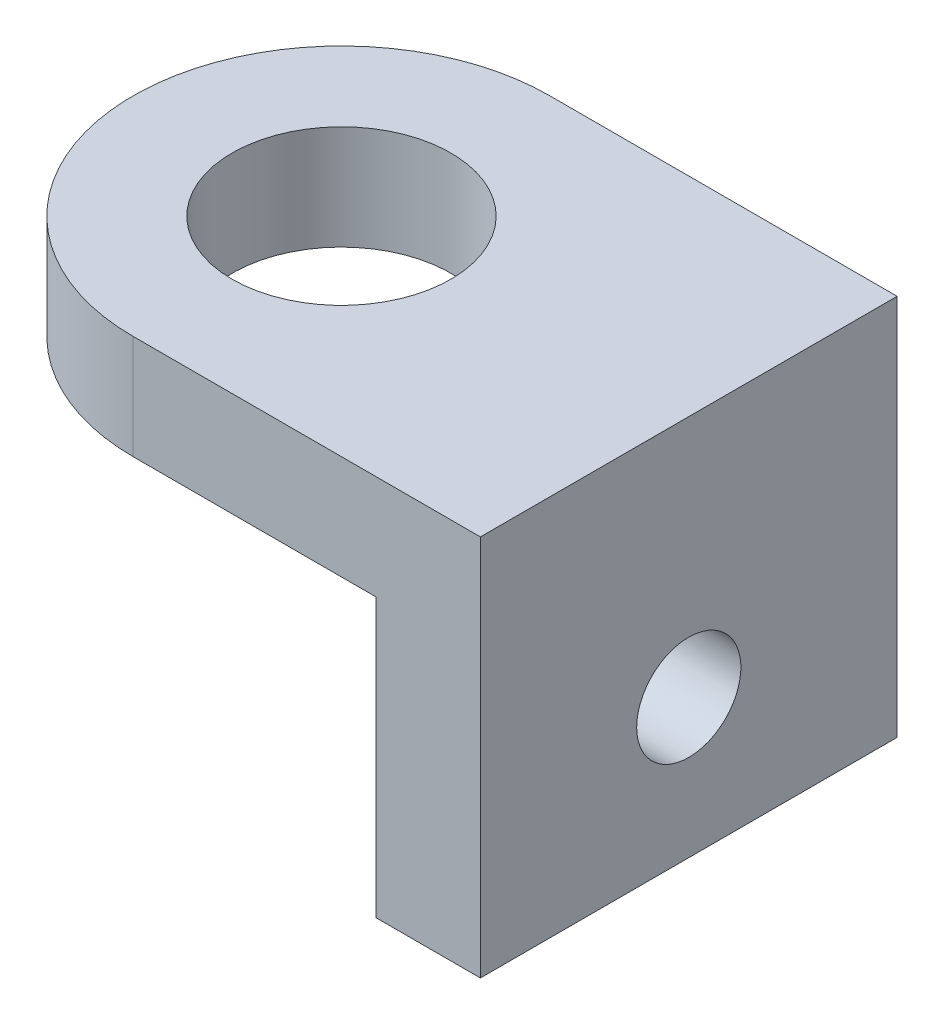
ISO-10303-21;
HEADER;
FILE_DESCRIPTION(('STEP AP214'),'2;1');
FILE_NAME('part.step','',(''),(''),'','','');
FILE_SCHEMA(('AUTOMOTIVE_DESIGN { 1 0 10303 214 1 1 1 1 }'));
ENDSEC;
DATA;
#1=APPLICATION_CONTEXT('core data for automotive mechanical design processes');
#2=APPLICATION_PROTOCOL_DEFINITION('international standard','automotive_design',2000,#1);
#3=PRODUCT_CONTEXT('',#1,'mechanical');
#4=PRODUCT('Part','Part','',(#3));
#5=PRODUCT_RELATED_PRODUCT_CATEGORY('part','',(#4));
#6=PRODUCT_DEFINITION_FORMATION('','',#4);
#7=PRODUCT_DEFINITION_CONTEXT('part definition',#1,'design');
#8=PRODUCT_DEFINITION('design','',#6,#7);
#9=PRODUCT_DEFINITION_SHAPE('','',#8);
#10=(LENGTH_UNIT() NAMED_UNIT(*) SI_UNIT(.MILLI.,.METRE.));
#11=(NAMED_UNIT(*) PLANE_ANGLE_UNIT() SI_UNIT($,.RADIAN.));
#12=(NAMED_UNIT(*) SI_UNIT($,.STERADIAN.) SOLID_ANGLE_UNIT());
#13=UNCERTAINTY_MEASURE_WITH_UNIT(LENGTH_MEASURE(1.E-05),#10,'distance_accuracy_value','');
#14=(GEOMETRIC_REPRESENTATION_CONTEXT(3) GLOBAL_UNCERTAINTY_ASSIGNED_CONTEXT((#13)) GLOBAL_UNIT_ASSIGNED_CONTEXT((#10,
#11,#12)) REPRESENTATION_CONTEXT('',''));
#15=CARTESIAN_POINT('',(0.,0.,0.));
#16=DIRECTION('',(0.,0.,1.));
#17=DIRECTION('',(1.,0.,0.));
#18=AXIS2_PLACEMENT_3D('',#15,#16,#17);
#19=CARTESIAN_POINT('',(0.,3.,6.));
#20=DIRECTION('',(0.,0.,-1.));
#21=DIRECTION('',(-1.,0.,0.));
#22=AXIS2_PLACEMENT_3D('',#19,#20,#21);
#23=PLANE('',#22);
#24=DIRECTION('',(1.,0.,0.));
#25=VECTOR('',#24,1.);
#26=CARTESIAN_POINT('',(0.,0.,6.));
#27=LINE('',#26,#25);
#28=CARTESIAN_POINT('',(0.,0.,6.));
#29=VERTEX_POINT('',#28);
#30=CARTESIAN_POINT('',(7.,0.,6.));
#31=VERTEX_POINT('',#30);
#32=EDGE_CURVE('E101',#29,#31,#27,.T.);
#33=ORIENTED_EDGE('',*,*,#32,.T.);
#34=DIRECTION('',(0.,1.,0.));
#35=VECTOR('',#34,1.);
#36=CARTESIAN_POINT('',(7.,-8.,6.));
#37=LINE('',#36,#35);
#38=CARTESIAN_POINT('',(7.,-8.,6.));
#39=VERTEX_POINT('',#38);
#40=EDGE_CURVE('E51',#39,#31,#37,.T.);
#41=ORIENTED_EDGE('',*,*,#40,.F.);
#42=DIRECTION('',(1.,0.,0.));
#43=VECTOR('',#42,1.);
#44=CARTESIAN_POINT('',(0.,-8.,6.));
#45=LINE('',#44,#43);
#46=CARTESIAN_POINT('',(10.,-8.,6.));
#47=VERTEX_POINT('',#46);
#48=EDGE_CURVE('E99',#39,#47,#45,.T.);
#49=ORIENTED_EDGE('',*,*,#48,.T.);
#50=DIRECTION('',(0.,-1.,0.));
#51=VECTOR('',#50,1.);
#52=CARTESIAN_POINT('',(10.,3.,6.));
#53=LINE('',#52,#51);
#54=CARTESIAN_POINT('',(10.,3.,6.));
#55=VERTEX_POINT('',#54);
#56=EDGE_CURVE('E11',#55,#47,#53,.T.);
#57=ORIENTED_EDGE('',*,*,#56,.F.);
#58=DIRECTION('',(1.,0.,0.));
#59=VECTOR('',#58,1.);
#60=CARTESIAN_POINT('',(0.,3.,6.));
#61=LINE('',#60,#59);
#62=CARTESIAN_POINT('',(0.,3.,6.));
#63=VERTEX_POINT('',#62);
#64=EDGE_CURVE('E80',#63,#55,#61,.T.);
#65=ORIENTED_EDGE('',*,*,#64,.F.);
#66=DIRECTION('',(0.,-1.,0.));
#67=VECTOR('',#66,1.);
#68=CARTESIAN_POINT('',(0.,3.,6.));
#69=LINE('',#68,#67);
#70=EDGE_CURVE('E139',#63,#29,#69,.T.);
#71=ORIENTED_EDGE('',*,*,#70,.T.);
#72=EDGE_LOOP('',(#33,#41,#49,#57,#65,#71));
#73=FACE_BOUND('',#72,.T.);
#74=ADVANCED_FACE('F37',(#73),#23,.F.);
#75=CARTESIAN_POINT('',(10.,3.,0.));
#76=DIRECTION('',(1.,0.,0.));
#77=DIRECTION('',(0.,0.,-1.));
#78=AXIS2_PLACEMENT_3D('',#75,#76,#77);
#79=PLANE('',#78);
#80=CARTESIAN_POINT('',(10.,-4.,0.));
#81=DIRECTION('',(-1.,0.,0.));
#82=DIRECTION('',(0.,0.,1.));
#83=AXIS2_PLACEMENT_3D('',#80,#81,#82);
#84=CIRCLE('',#83,1.5);
#85=CARTESIAN_POINT('',(10.,-4.,1.5));
#86=VERTEX_POINT('',#85);
#87=EDGE_CURVE('E118',#86,#86,#84,.T.);
#88=ORIENTED_EDGE('',*,*,#87,.T.);
#89=EDGE_LOOP('',(#88));
#90=FACE_BOUND('',#89,.T.);
#91=ORIENTED_EDGE('',*,*,#56,.T.);
#92=DIRECTION('',(0.,0.,1.));
#93=VECTOR('',#92,1.);
#94=CARTESIAN_POINT('',(10.,-8.,0.));
#95=LINE('',#94,#93);
#96=CARTESIAN_POINT('',(10.,-8.,-6.));
#97=VERTEX_POINT('',#96);
#98=EDGE_CURVE('E112',#97,#47,#95,.T.);
#99=ORIENTED_EDGE('',*,*,#98,.F.);
#100=DIRECTION('',(0.,-1.,0.));
#101=VECTOR('',#100,1.);
#102=CARTESIAN_POINT('',(10.,3.,-6.));
#103=LINE('',#102,#101);
#104=CARTESIAN_POINT('',(10.,3.,-6.));
#105=VERTEX_POINT('',#104);
#106=EDGE_CURVE('E44',#105,#97,#103,.T.);
#107=ORIENTED_EDGE('',*,*,#106,.F.);
#108=DIRECTION('',(0.,0.,1.));
#109=VECTOR('',#108,1.);
#110=CARTESIAN_POINT('',(10.,3.,0.));
#111=LINE('',#110,#109);
#112=EDGE_CURVE('E128',#105,#55,#111,.T.);
#113=ORIENTED_EDGE('',*,*,#112,.T.);
#114=EDGE_LOOP('',(#91,#99,#107,#113));
#115=FACE_BOUND('',#114,.T.);
#116=ADVANCED_FACE('F153',(#90,#115),#79,.T.);
#117=CARTESIAN_POINT('',(0.,3.,-6.));
#118=DIRECTION('',(0.,0.,-1.));
#119=DIRECTION('',(-1.,0.,0.));
#120=AXIS2_PLACEMENT_3D('',#117,#118,#119);
#121=PLANE('',#120);
#122=DIRECTION('',(1.,0.,0.));
#123=VECTOR('',#122,1.);
#124=CARTESIAN_POINT('',(0.,0.,-6.));
#125=LINE('',#124,#123);
#126=CARTESIAN_POINT('',(0.,0.,-6.));
#127=VERTEX_POINT('',#126);
#128=CARTESIAN_POINT('',(7.,0.,-6.));
#129=VERTEX_POINT('',#128);
#130=EDGE_CURVE('E141',#127,#129,#125,.T.);
#131=ORIENTED_EDGE('',*,*,#130,.F.);
#132=DIRECTION('',(0.,-1.,0.));
#133=VECTOR('',#132,1.);
#134=CARTESIAN_POINT('',(0.,3.,-6.));
#135=LINE('',#134,#133);
#136=CARTESIAN_POINT('',(0.,3.,-6.));
#137=VERTEX_POINT('',#136);
#138=EDGE_CURVE('E148',#137,#127,#135,.T.);
#139=ORIENTED_EDGE('',*,*,#138,.F.);
#140=DIRECTION('',(1.,0.,0.));
#141=VECTOR('',#140,1.);
#142=CARTESIAN_POINT('',(0.,3.,-6.));
#143=LINE('',#142,#141);
#144=EDGE_CURVE('E132',#137,#105,#143,.T.);
#145=ORIENTED_EDGE('',*,*,#144,.T.);
#146=ORIENTED_EDGE('',*,*,#106,.T.);
#147=DIRECTION('',(1.,0.,0.));
#148=VECTOR('',#147,1.);
#149=CARTESIAN_POINT('',(0.,-8.,-6.));
#150=LINE('',#149,#148);
#151=CARTESIAN_POINT('',(7.,-8.,-6.));
#152=VERTEX_POINT('',#151);
#153=EDGE_CURVE('E103',#152,#97,#150,.T.);
#154=ORIENTED_EDGE('',*,*,#153,.F.);
#155=DIRECTION('',(0.,1.,0.));
#156=VECTOR('',#155,1.);
#157=CARTESIAN_POINT('',(7.,-8.,-6.));
#158=LINE('',#157,#156);
#159=EDGE_CURVE('E102',#152,#129,#158,.T.);
#160=ORIENTED_EDGE('',*,*,#159,.T.);
#161=EDGE_LOOP('',(#131,#139,#145,#146,#154,#160));
#162=FACE_BOUND('',#161,.T.);
#163=ADVANCED_FACE('F151',(#162),#121,.T.);
#164=CARTESIAN_POINT('',(0.,3.,0.));
#165=DIRECTION('',(0.,-1.,0.));
#166=DIRECTION('',(0.,0.,-1.));
#167=AXIS2_PLACEMENT_3D('',#164,#165,#166);
#168=CYLINDRICAL_SURFACE('',#167,6.);
#169=CARTESIAN_POINT('',(0.,0.,0.));
#170=DIRECTION('',(0.,1.,0.));
#171=DIRECTION('',(0.,0.,1.));
#172=AXIS2_PLACEMENT_3D('',#169,#170,#171);
#173=CIRCLE('',#172,6.);
#174=EDGE_CURVE('E75',#127,#29,#173,.T.);
#175=ORIENTED_EDGE('',*,*,#174,.T.);
#176=ORIENTED_EDGE('',*,*,#70,.F.);
#177=CARTESIAN_POINT('',(0.,3.,0.));
#178=DIRECTION('',(0.,1.,0.));
#179=DIRECTION('',(0.,0.,1.));
#180=AXIS2_PLACEMENT_3D('',#177,#178,#179);
#181=CIRCLE('',#180,6.);
#182=EDGE_CURVE('E60',#137,#63,#181,.T.);
#183=ORIENTED_EDGE('',*,*,#182,.F.);
#184=ORIENTED_EDGE('',*,*,#138,.T.);
#185=EDGE_LOOP('',(#175,#176,#183,#184));
#186=FACE_BOUND('',#185,.T.);
#187=ADVANCED_FACE('F157',(#186),#168,.T.);
#188=CARTESIAN_POINT('',(0.,3.,0.));
#189=DIRECTION('',(0.,-1.,0.));
#190=DIRECTION('',(0.,0.,-1.));
#191=AXIS2_PLACEMENT_3D('',#188,#189,#190);
#192=CYLINDRICAL_SURFACE('',#191,3.15);
#193=CARTESIAN_POINT('',(0.,3.,0.));
#194=DIRECTION('',(0.,1.,0.));
#195=DIRECTION('',(0.,0.,1.));
#196=AXIS2_PLACEMENT_3D('',#193,#194,#195);
#197=CIRCLE('',#196,3.15);
#198=CARTESIAN_POINT('',(0.,3.,3.15));
#199=VERTEX_POINT('',#198);
#200=EDGE_CURVE('E136',#199,#199,#197,.T.);
#201=ORIENTED_EDGE('',*,*,#200,.T.);
#202=EDGE_LOOP('',(#201));
#203=FACE_BOUND('',#202,.T.);
#204=CARTESIAN_POINT('',(0.,0.,0.));
#205=DIRECTION('',(0.,1.,0.));
#206=DIRECTION('',(0.,0.,1.));
#207=AXIS2_PLACEMENT_3D('',#204,#205,#206);
#208=CIRCLE('',#207,3.15);
#209=CARTESIAN_POINT('',(0.,0.,3.15));
#210=VERTEX_POINT('',#209);
#211=EDGE_CURVE('E129',#210,#210,#208,.T.);
#212=ORIENTED_EDGE('',*,*,#211,.F.);
#213=EDGE_LOOP('',(#212));
#214=FACE_BOUND('',#213,.T.);
#215=ADVANCED_FACE('F161',(#203,#214),#192,.F.);
#216=CARTESIAN_POINT('',(0.,3.,0.));
#217=DIRECTION('',(0.,1.,0.));
#218=DIRECTION('',(0.,0.,1.));
#219=AXIS2_PLACEMENT_3D('',#216,#217,#218);
#220=PLANE('',#219);
#221=ORIENTED_EDGE('',*,*,#64,.T.);
#222=ORIENTED_EDGE('',*,*,#112,.F.);
#223=ORIENTED_EDGE('',*,*,#144,.F.);
#224=ORIENTED_EDGE('',*,*,#182,.T.);
#225=EDGE_LOOP('',(#221,#222,#223,#224));
#226=FACE_BOUND('',#225,.T.);
#227=ORIENTED_EDGE('',*,*,#200,.F.);
#228=EDGE_LOOP('',(#227));
#229=FACE_BOUND('',#228,.T.);
#230=ADVANCED_FACE('F158',(#226,#229),#220,.T.);
#231=CARTESIAN_POINT('',(0.,0.,0.));
#232=DIRECTION('',(0.,1.,0.));
#233=DIRECTION('',(0.,0.,1.));
#234=AXIS2_PLACEMENT_3D('',#231,#232,#233);
#235=PLANE('',#234);
#236=ORIENTED_EDGE('',*,*,#130,.T.);
#237=DIRECTION('',(0.,0.,1.));
#238=VECTOR('',#237,1.);
#239=CARTESIAN_POINT('',(7.,0.,0.));
#240=LINE('',#239,#238);
#241=EDGE_CURVE('E116',#129,#31,#240,.T.);
#242=ORIENTED_EDGE('',*,*,#241,.T.);
#243=ORIENTED_EDGE('',*,*,#32,.F.);
#244=ORIENTED_EDGE('',*,*,#174,.F.);
#245=EDGE_LOOP('',(#236,#242,#243,#244));
#246=FACE_BOUND('',#245,.T.);
#247=ORIENTED_EDGE('',*,*,#211,.T.);
#248=EDGE_LOOP('',(#247));
#249=FACE_BOUND('',#248,.T.);
#250=ADVANCED_FACE('F155',(#246,#249),#235,.F.);
#251=CARTESIAN_POINT('',(7.,-8.,0.));
#252=DIRECTION('',(-1.,0.,0.));
#253=DIRECTION('',(0.,0.,1.));
#254=AXIS2_PLACEMENT_3D('',#251,#252,#253);
#255=PLANE('',#254);
#256=CARTESIAN_POINT('',(7.,-4.,0.));
#257=DIRECTION('',(-1.,0.,0.));
#258=DIRECTION('',(0.,0.,1.));
#259=AXIS2_PLACEMENT_3D('',#256,#257,#258);
#260=CIRCLE('',#259,1.5);
#261=CARTESIAN_POINT('',(7.,-4.,1.5));
#262=VERTEX_POINT('',#261);
#263=EDGE_CURVE('E121',#262,#262,#260,.T.);
#264=ORIENTED_EDGE('',*,*,#263,.F.);
#265=EDGE_LOOP('',(#264));
#266=FACE_BOUND('',#265,.T.);
#267=ORIENTED_EDGE('',*,*,#241,.F.);
#268=ORIENTED_EDGE('',*,*,#159,.F.);
#269=DIRECTION('',(0.,0.,1.));
#270=VECTOR('',#269,1.);
#271=CARTESIAN_POINT('',(7.,-8.,0.));
#272=LINE('',#271,#270);
#273=EDGE_CURVE('E110',#152,#39,#272,.T.);
#274=ORIENTED_EDGE('',*,*,#273,.T.);
#275=ORIENTED_EDGE('',*,*,#40,.T.);
#276=EDGE_LOOP('',(#267,#268,#274,#275));
#277=FACE_BOUND('',#276,.T.);
#278=ADVANCED_FACE('F114',(#266,#277),#255,.T.);
#279=CARTESIAN_POINT('',(0.,-8.,0.));
#280=DIRECTION('',(0.,1.,0.));
#281=DIRECTION('',(0.,0.,1.));
#282=AXIS2_PLACEMENT_3D('',#279,#280,#281);
#283=PLANE('',#282);
#284=ORIENTED_EDGE('',*,*,#273,.F.);
#285=ORIENTED_EDGE('',*,*,#153,.T.);
#286=ORIENTED_EDGE('',*,*,#98,.T.);
#287=ORIENTED_EDGE('',*,*,#48,.F.);
#288=EDGE_LOOP('',(#284,#285,#286,#287));
#289=FACE_BOUND('',#288,.T.);
#290=ADVANCED_FACE('F108',(#289),#283,.F.);
#291=CARTESIAN_POINT('',(10.,-4.,0.));
#292=DIRECTION('',(-1.,0.,0.));
#293=DIRECTION('',(0.,0.,1.));
#294=AXIS2_PLACEMENT_3D('',#291,#292,#293);
#295=CYLINDRICAL_SURFACE('',#294,1.5);
#296=ORIENTED_EDGE('',*,*,#87,.F.);
#297=EDGE_LOOP('',(#296));
#298=FACE_BOUND('',#297,.T.);
#299=ORIENTED_EDGE('',*,*,#263,.T.);
#300=EDGE_LOOP('',(#299));
#301=FACE_BOUND('',#300,.T.);
#302=ADVANCED_FACE('F227',(#298,#301),#295,.F.);
#303=CLOSED_SHELL('',(#74,#116,#163,#187,#215,#230,#250,#278,#290,#302));
#304=MANIFOLD_SOLID_BREP('B2',#303);
#305=ADVANCED_BREP_SHAPE_REPRESENTATION('',(#18,#304),#14);
#306=SHAPE_DEFINITION_REPRESENTATION(#9,#305);
ENDSEC;
END-ISO-10303-21;
